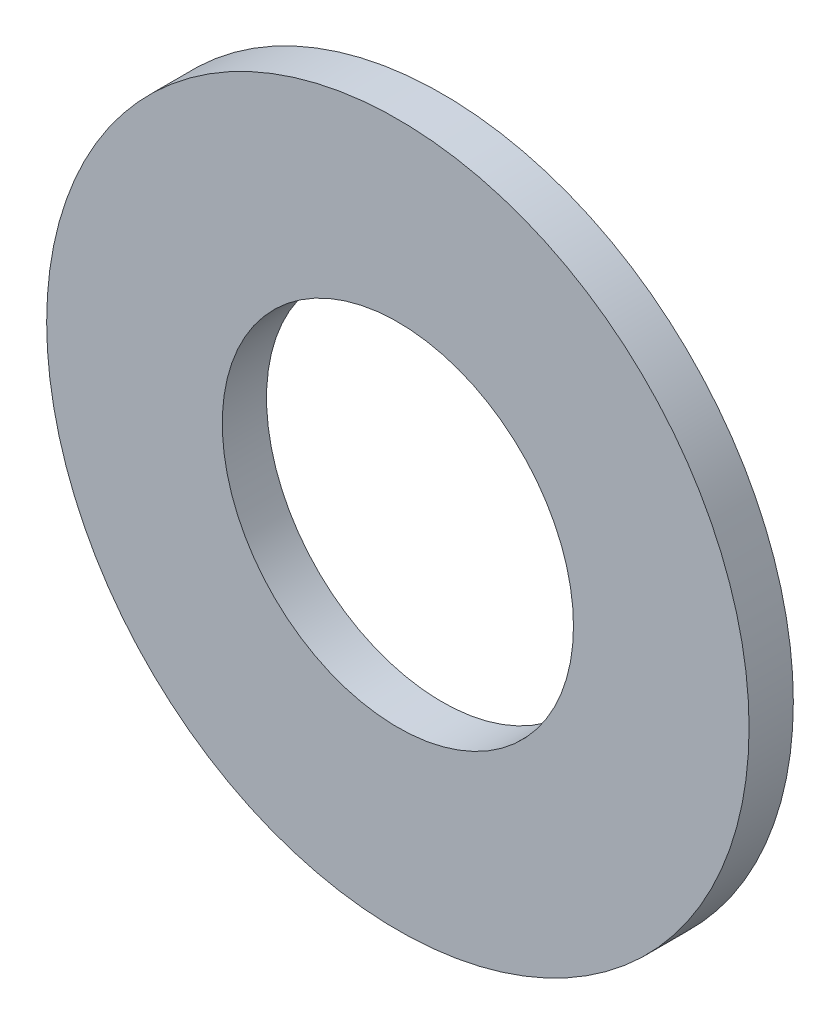
ISO-10303-21;
HEADER;
FILE_DESCRIPTION(('STEP AP214'),'2;1');
FILE_NAME('part.step','',(''),(''),'','','');
FILE_SCHEMA(('AUTOMOTIVE_DESIGN { 1 0 10303 214 1 1 1 1 }'));
ENDSEC;
DATA;
#1=APPLICATION_CONTEXT('core data for automotive mechanical design processes');
#2=APPLICATION_PROTOCOL_DEFINITION('international standard','automotive_design',2000,#1);
#3=PRODUCT_CONTEXT('',#1,'mechanical');
#4=PRODUCT('Part','Part','',(#3));
#5=PRODUCT_RELATED_PRODUCT_CATEGORY('part','',(#4));
#6=PRODUCT_DEFINITION_FORMATION('','',#4);
#7=PRODUCT_DEFINITION_CONTEXT('part definition',#1,'design');
#8=PRODUCT_DEFINITION('design','',#6,#7);
#9=PRODUCT_DEFINITION_SHAPE('','',#8);
#10=(LENGTH_UNIT() NAMED_UNIT(*) SI_UNIT(.MILLI.,.METRE.));
#11=(NAMED_UNIT(*) PLANE_ANGLE_UNIT() SI_UNIT($,.RADIAN.));
#12=(NAMED_UNIT(*) SI_UNIT($,.STERADIAN.) SOLID_ANGLE_UNIT());
#13=UNCERTAINTY_MEASURE_WITH_UNIT(LENGTH_MEASURE(1.E-05),#10,'distance_accuracy_value','');
#14=(GEOMETRIC_REPRESENTATION_CONTEXT(3) GLOBAL_UNCERTAINTY_ASSIGNED_CONTEXT((#13)) GLOBAL_UNIT_ASSIGNED_CONTEXT((#10,
#11,#12)) REPRESENTATION_CONTEXT('',''));
#15=CARTESIAN_POINT('',(0.,0.,0.));
#16=DIRECTION('',(0.,0.,1.));
#17=DIRECTION('',(1.,0.,0.));
#18=AXIS2_PLACEMENT_3D('',#15,#16,#17);
#19=CARTESIAN_POINT('',(0.,0.,1.6002));
#20=DIRECTION('',(0.,0.,1.));
#21=DIRECTION('',(1.,0.,0.));
#22=AXIS2_PLACEMENT_3D('',#19,#20,#21);
#23=PLANE('',#22);
#24=CARTESIAN_POINT('',(0.,0.,1.6002));
#25=DIRECTION('',(0.,0.,1.));
#26=DIRECTION('',(1.,0.,0.));
#27=AXIS2_PLACEMENT_3D('',#24,#25,#26);
#28=CIRCLE('',#27,12.7);
#29=CARTESIAN_POINT('',(12.7,0.,1.6002));
#30=VERTEX_POINT('',#29);
#31=EDGE_CURVE('E10',#30,#30,#28,.T.);
#32=ORIENTED_EDGE('',*,*,#31,.T.);
#33=EDGE_LOOP('',(#32));
#34=FACE_BOUND('',#33,.T.);
#35=CARTESIAN_POINT('',(0.,0.,1.6002));
#36=DIRECTION('',(0.,0.,1.));
#37=DIRECTION('',(1.,0.,0.));
#38=AXIS2_PLACEMENT_3D('',#35,#36,#37);
#39=CIRCLE('',#38,6.35);
#40=CARTESIAN_POINT('',(6.35,0.,1.6002));
#41=VERTEX_POINT('',#40);
#42=EDGE_CURVE('E54',#41,#41,#39,.T.);
#43=ORIENTED_EDGE('',*,*,#42,.F.);
#44=EDGE_LOOP('',(#43));
#45=FACE_BOUND('',#44,.T.);
#46=ADVANCED_FACE('F41',(#34,#45),#23,.T.);
#47=CARTESIAN_POINT('',(0.,0.,0.));
#48=DIRECTION('',(0.,0.,1.));
#49=DIRECTION('',(1.,0.,0.));
#50=AXIS2_PLACEMENT_3D('',#47,#48,#49);
#51=PLANE('',#50);
#52=CARTESIAN_POINT('',(0.,0.,0.));
#53=DIRECTION('',(0.,0.,1.));
#54=DIRECTION('',(1.,0.,0.));
#55=AXIS2_PLACEMENT_3D('',#52,#53,#54);
#56=CIRCLE('',#55,12.7);
#57=CARTESIAN_POINT('',(12.7,0.,0.));
#58=VERTEX_POINT('',#57);
#59=EDGE_CURVE('E45',#58,#58,#56,.T.);
#60=ORIENTED_EDGE('',*,*,#59,.F.);
#61=EDGE_LOOP('',(#60));
#62=FACE_BOUND('',#61,.T.);
#63=CARTESIAN_POINT('',(0.,0.,0.));
#64=DIRECTION('',(0.,0.,1.));
#65=DIRECTION('',(1.,0.,0.));
#66=AXIS2_PLACEMENT_3D('',#63,#64,#65);
#67=CIRCLE('',#66,6.35);
#68=CARTESIAN_POINT('',(6.35,0.,0.));
#69=VERTEX_POINT('',#68);
#70=EDGE_CURVE('E56',#69,#69,#67,.T.);
#71=ORIENTED_EDGE('',*,*,#70,.T.);
#72=EDGE_LOOP('',(#71));
#73=FACE_BOUND('',#72,.T.);
#74=ADVANCED_FACE('F68',(#62,#73),#51,.F.);
#75=CARTESIAN_POINT('',(0.,0.,1.6002));
#76=DIRECTION('',(0.,0.,-1.));
#77=DIRECTION('',(-1.,0.,0.));
#78=AXIS2_PLACEMENT_3D('',#75,#76,#77);
#79=CYLINDRICAL_SURFACE('',#78,12.7);
#80=ORIENTED_EDGE('',*,*,#31,.F.);
#81=EDGE_LOOP('',(#80));
#82=FACE_BOUND('',#81,.T.);
#83=ORIENTED_EDGE('',*,*,#59,.T.);
#84=EDGE_LOOP('',(#83));
#85=FACE_BOUND('',#84,.T.);
#86=ADVANCED_FACE('F43',(#82,#85),#79,.T.);
#87=CARTESIAN_POINT('',(0.,0.,1.6002));
#88=DIRECTION('',(0.,0.,-1.));
#89=DIRECTION('',(-1.,0.,0.));
#90=AXIS2_PLACEMENT_3D('',#87,#88,#89);
#91=CYLINDRICAL_SURFACE('',#90,6.35);
#92=ORIENTED_EDGE('',*,*,#42,.T.);
#93=EDGE_LOOP('',(#92));
#94=FACE_BOUND('',#93,.T.);
#95=ORIENTED_EDGE('',*,*,#70,.F.);
#96=EDGE_LOOP('',(#95));
#97=FACE_BOUND('',#96,.T.);
#98=ADVANCED_FACE('F64',(#94,#97),#91,.F.);
#99=CLOSED_SHELL('',(#46,#74,#86,#98));
#100=MANIFOLD_SOLID_BREP('B2',#99);
#101=ADVANCED_BREP_SHAPE_REPRESENTATION('',(#18,#100),#14);
#102=SHAPE_DEFINITION_REPRESENTATION(#9,#101);
ENDSEC;
END-ISO-10303-21;
